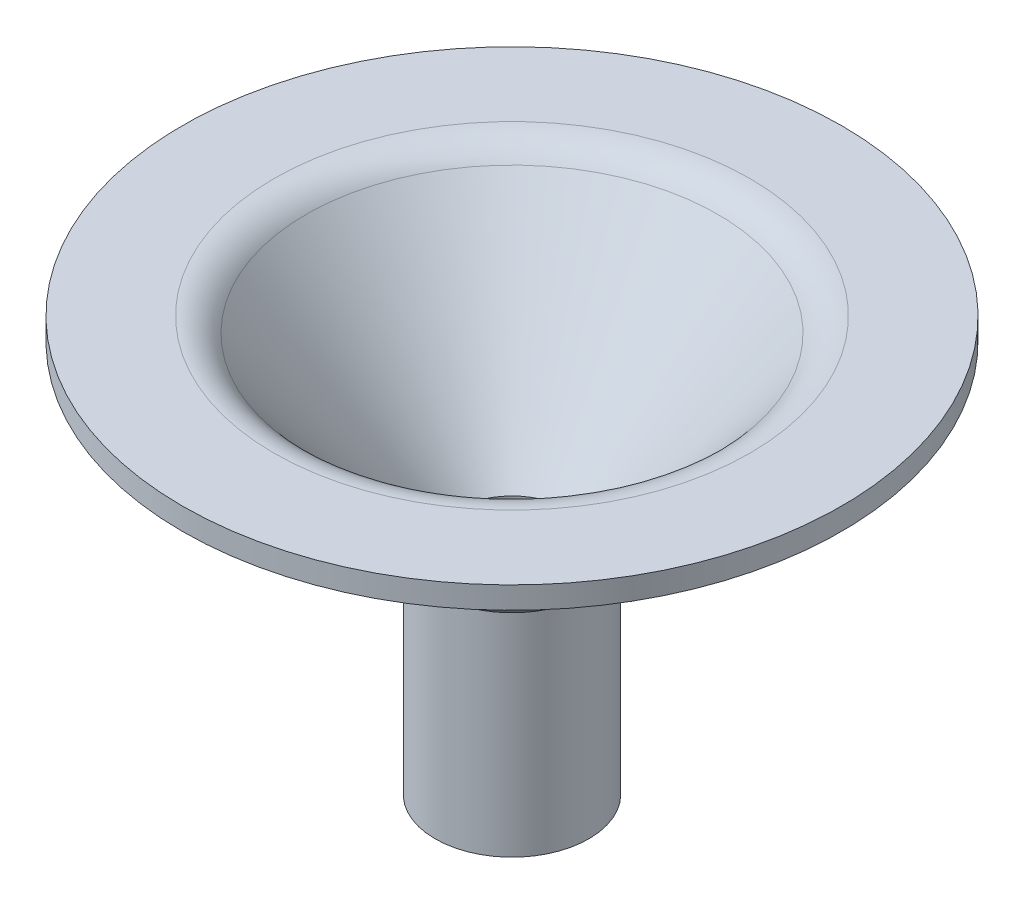
ISO-10303-21;
HEADER;
FILE_DESCRIPTION(('STEP AP214'),'2;1');
FILE_NAME('part.step','',(''),(''),'','','');
FILE_SCHEMA(('AUTOMOTIVE_DESIGN { 1 0 10303 214 1 1 1 1 }'));
ENDSEC;
DATA;
#1=APPLICATION_CONTEXT('core data for automotive mechanical design processes');
#2=APPLICATION_PROTOCOL_DEFINITION('international standard','automotive_design',2000,#1);
#3=PRODUCT_CONTEXT('',#1,'mechanical');
#4=PRODUCT('Part','Part','',(#3));
#5=PRODUCT_RELATED_PRODUCT_CATEGORY('part','',(#4));
#6=PRODUCT_DEFINITION_FORMATION('','',#4);
#7=PRODUCT_DEFINITION_CONTEXT('part definition',#1,'design');
#8=PRODUCT_DEFINITION('design','',#6,#7);
#9=PRODUCT_DEFINITION_SHAPE('','',#8);
#10=(LENGTH_UNIT() NAMED_UNIT(*) SI_UNIT(.MILLI.,.METRE.));
#11=(NAMED_UNIT(*) PLANE_ANGLE_UNIT() SI_UNIT($,.RADIAN.));
#12=(NAMED_UNIT(*) SI_UNIT($,.STERADIAN.) SOLID_ANGLE_UNIT());
#13=UNCERTAINTY_MEASURE_WITH_UNIT(LENGTH_MEASURE(1.E-05),#10,'distance_accuracy_value','');
#14=(GEOMETRIC_REPRESENTATION_CONTEXT(3) GLOBAL_UNCERTAINTY_ASSIGNED_CONTEXT((#13)) GLOBAL_UNIT_ASSIGNED_CONTEXT((#10,
#11,#12)) REPRESENTATION_CONTEXT('',''));
#15=CARTESIAN_POINT('',(0.,0.,0.));
#16=DIRECTION('',(0.,0.,1.));
#17=DIRECTION('',(1.,0.,0.));
#18=AXIS2_PLACEMENT_3D('',#15,#16,#17);
#19=CARTESIAN_POINT('',(0.,3.37655174054899,15.));
#20=DIRECTION('',(0.,1.,0.));
#21=DIRECTION('',(0.,0.,1.));
#22=AXIS2_PLACEMENT_3D('',#19,#20,#21);
#23=PLANE('',#22);
#24=CARTESIAN_POINT('',(0.,3.37655174054898,0.));
#25=DIRECTION('',(0.,1.,0.));
#26=DIRECTION('',(0.,0.,1.));
#27=AXIS2_PLACEMENT_3D('',#24,#25,#26);
#28=CIRCLE('',#27,15.);
#29=CARTESIAN_POINT('',(0.,3.37655174054898,15.));
#30=VERTEX_POINT('',#29);
#31=EDGE_CURVE('E65',#30,#30,#28,.T.);
#32=ORIENTED_EDGE('',*,*,#31,.T.);
#33=EDGE_LOOP('',(#32));
#34=FACE_BOUND('',#33,.T.);
#35=CARTESIAN_POINT('',(0.,3.37655174054901,0.));
#36=DIRECTION('',(0.,1.,0.));
#37=DIRECTION('',(0.,0.,1.));
#38=AXIS2_PLACEMENT_3D('',#35,#36,#37);
#39=CIRCLE('',#38,10.8294505966195);
#40=CARTESIAN_POINT('',(0.,3.37655174054901,10.8294505966195));
#41=VERTEX_POINT('',#40);
#42=EDGE_CURVE('E10',#41,#41,#39,.T.);
#43=ORIENTED_EDGE('',*,*,#42,.F.);
#44=EDGE_LOOP('',(#43));
#45=FACE_BOUND('',#44,.T.);
#46=ADVANCED_FACE('F31',(#34,#45),#23,.T.);
#47=CARTESIAN_POINT('',(0.,1.46823217846935,0.));
#48=DIRECTION('',(0.,1.,0.));
#49=DIRECTION('',(0.,0.,1.));
#50=AXIS2_PLACEMENT_3D('',#47,#48,#49);
#51=TOROIDAL_SURFACE('',#50,10.8294505966195,1.90831956207966);
#52=ORIENTED_EDGE('',*,*,#42,.T.);
#53=EDGE_LOOP('',(#52));
#54=FACE_BOUND('',#53,.T.);
#55=CARTESIAN_POINT('',(0.,2.69487634829658,0.));
#56=DIRECTION('',(0.,1.,0.));
#57=DIRECTION('',(0.,0.,1.));
#58=AXIS2_PLACEMENT_3D('',#55,#56,#57);
#59=CIRCLE('',#58,9.36759300039304);
#60=CARTESIAN_POINT('',(0.,2.69487634829658,9.36759300039304));
#61=VERTEX_POINT('',#60);
#62=EDGE_CURVE('E37',#61,#61,#59,.T.);
#63=ORIENTED_EDGE('',*,*,#62,.F.);
#64=EDGE_LOOP('',(#63));
#65=FACE_BOUND('',#64,.T.);
#66=ADVANCED_FACE('F83',(#54,#65),#51,.T.);
#67=CARTESIAN_POINT('',(0.,-5.48960228239688,0.));
#68=DIRECTION('',(0.,1.,0.));
#69=DIRECTION('',(0.,0.,1.));
#70=AXIS2_PLACEMENT_3D('',#67,#68,#69);
#71=CONICAL_SURFACE('',#70,2.5,0.698131700797719);
#72=CARTESIAN_POINT('',(0.,-5.48960228239688,0.));
#73=DIRECTION('',(0.,1.,0.));
#74=DIRECTION('',(0.,0.,1.));
#75=AXIS2_PLACEMENT_3D('',#72,#73,#74);
#76=CIRCLE('',#75,2.5);
#77=CARTESIAN_POINT('',(0.,-5.48960228239688,2.5));
#78=VERTEX_POINT('',#77);
#79=EDGE_CURVE('E41',#78,#78,#76,.T.);
#80=CARTESIAN_POINT('',(0.,2.69487634829658,9.36759300039304));
#81=CARTESIAN_POINT('',(0.,2.60962136256019,9.29605557330561));
#82=CARTESIAN_POINT('',(0.,2.5243663768238,9.22451814621819));
#83=CARTESIAN_POINT('',(0.,2.35385640535102,9.08144329204333));
#84=CARTESIAN_POINT('',(0.,2.26860141961463,9.0099058649559));
#85=CARTESIAN_POINT('',(0.,2.09809144814185,8.86683101078105));
#86=CARTESIAN_POINT('',(0.,2.01283646240546,8.79529358369362));
#87=CARTESIAN_POINT('',(0.,1.84232649093268,8.65221872951877));
#88=CARTESIAN_POINT('',(0.,1.75707150519629,8.58068130243134));
#89=CARTESIAN_POINT('',(0.,1.58656153372351,8.43760644825648));
#90=CARTESIAN_POINT('',(0.,1.50130654798712,8.36606902116906));
#91=CARTESIAN_POINT('',(0.,1.33079657651434,8.2229941669942));
#92=CARTESIAN_POINT('',(0.,1.24554159077795,8.15145673990677));
#93=CARTESIAN_POINT('',(0.,1.07503161930517,8.00838188573192));
#94=CARTESIAN_POINT('',(0.,0.989776633568776,7.93684445864449));
#95=CARTESIAN_POINT('',(0.,0.819266662095995,7.79376960446963));
#96=CARTESIAN_POINT('',(0.,0.734011676359605,7.72223217738221));
#97=CARTESIAN_POINT('',(0.,0.563501704886824,7.57915732320735));
#98=CARTESIAN_POINT('',(0.,0.478246719150434,7.50761989611993));
#99=CARTESIAN_POINT('',(0.,0.307736747677653,7.36454504194507));
#100=CARTESIAN_POINT('',(0.,0.222481761941263,7.29300761485764));
#101=CARTESIAN_POINT('',(0.,0.0519717904684826,7.14993276068279));
#102=CARTESIAN_POINT('',(0.,-0.0332831952679078,7.07839533359536));
#103=CARTESIAN_POINT('',(0.,-0.203793166740688,6.93532047942051));
#104=CARTESIAN_POINT('',(0.,-0.289048152477078,6.86378305233308));
#105=CARTESIAN_POINT('',(0.,-0.459558123949859,6.72070819815822));
#106=CARTESIAN_POINT('',(0.,-0.544813109686249,6.6491707710708));
#107=CARTESIAN_POINT('',(0.,-0.71532308115903,6.50609591689594));
#108=CARTESIAN_POINT('',(0.,-0.80057806689542,6.43455848980851));
#109=CARTESIAN_POINT('',(0.,-0.971088038368201,6.29148363563366));
#110=CARTESIAN_POINT('',(0.,-1.05634302410459,6.21994620854623));
#111=CARTESIAN_POINT('',(0.,-1.22685299557737,6.07687135437138));
#112=CARTESIAN_POINT('',(0.,-1.31210798131376,6.00533392728395));
#113=CARTESIAN_POINT('',(0.,-1.48261795278654,5.86225907310909));
#114=CARTESIAN_POINT('',(0.,-1.56787293852293,5.79072164602167));
#115=CARTESIAN_POINT('',(0.,-1.73838290999571,5.64764679184681));
#116=CARTESIAN_POINT('',(0.,-1.8236378957321,5.57610936475939));
#117=CARTESIAN_POINT('',(0.,-1.99414786720488,5.43303451058453));
#118=CARTESIAN_POINT('',(0.,-2.07940285294127,5.3614970834971));
#119=CARTESIAN_POINT('',(0.,-2.24991282441405,5.21842222932225));
#120=CARTESIAN_POINT('',(0.,-2.33516781015044,5.14688480223482));
#121=CARTESIAN_POINT('',(0.,-2.50567778162323,5.00380994805996));
#122=CARTESIAN_POINT('',(0.,-2.59093276735962,4.93227252097254));
#123=CARTESIAN_POINT('',(0.,-2.7614427388324,4.78919766679768));
#124=CARTESIAN_POINT('',(0.,-2.84669772456879,4.71766023971025));
#125=CARTESIAN_POINT('',(0.,-3.01720769604157,4.5745853855354));
#126=CARTESIAN_POINT('',(0.,-3.10246268177796,4.50304795844797));
#127=CARTESIAN_POINT('',(0.,-3.27297265325074,4.35997310427312));
#128=CARTESIAN_POINT('',(0.,-3.35822763898713,4.28843567718569));
#129=CARTESIAN_POINT('',(0.,-3.52873761045991,4.14536082301083));
#130=CARTESIAN_POINT('',(0.,-3.6139925961963,4.07382339592341));
#131=CARTESIAN_POINT('',(0.,-3.78450256766908,3.93074854174855));
#132=CARTESIAN_POINT('',(0.,-3.86975755340547,3.85921111466112));
#133=CARTESIAN_POINT('',(0.,-4.04026752487825,3.71613626048627));
#134=CARTESIAN_POINT('',(0.,-4.12552251061464,3.64459883339884));
#135=CARTESIAN_POINT('',(0.,-4.29603248208742,3.50152397922399));
#136=CARTESIAN_POINT('',(0.,-4.38128746782381,3.42998655213656));
#137=CARTESIAN_POINT('',(0.,-4.55179743929659,3.2869116979617));
#138=CARTESIAN_POINT('',(0.,-4.63705242503298,3.21537427087428));
#139=CARTESIAN_POINT('',(0.,-4.80756239650576,3.07229941669942));
#140=CARTESIAN_POINT('',(0.,-4.89281738224215,3.00076198961199));
#141=CARTESIAN_POINT('',(0.,-5.06332735371493,2.85768713543714));
#142=CARTESIAN_POINT('',(0.,-5.14858233945132,2.78614970834971));
#143=CARTESIAN_POINT('',(0.,-5.3190923109241,2.64307485417486));
#144=CARTESIAN_POINT('',(0.,-5.40434729666049,2.57153742708743));
#145=CARTESIAN_POINT('',(0.,-5.48960228239688,2.5));
#146=B_SPLINE_CURVE_WITH_KNOTS('',3,(#80,#81,#82,#83,#84,#85,#86,#87,#88,#89,#90,#91,#92,#93,
#94,#95,#96,#97,#98,#99,#100,#101,#102,#103,#104,#105,#106,#107,#108,#109,#110,#111,#112,#113,
#114,#115,#116,#117,#118,#119,#120,#121,#122,#123,#124,#125,#126,#127,#128,#129,#130,#131,#132,
#133,#134,#135,#136,#137,#138,#139,#140,#141,#142,#143,#144,#145),.UNSPECIFIED.,.F.,.F.,(4,2,2,
2,2,2,2,2,2,2,2,2,2,2,2,2,2,2,2,2,2,2,2,2,2,2,2,2,2,2,2,2,4),(0.,0.333877439496607,
0.667754878993213,1.00163231848982,1.33550975798643,1.66938719748303,2.00326463697964,
2.33714207647624,2.67101951597285,3.00489695546946,3.33877439496606,3.67265183446267,
4.00652927395927,4.34040671345588,4.67428415295249,5.00816159244909,5.3420390319457,
5.6759164714423,6.00979391093891,6.34367135043552,6.67754878993212,7.01142622942873,
7.34530366892534,7.67918110842194,8.01305854791855,8.34693598741516,8.68081342691176,
9.01469086640837,9.34856830590497,9.68244574540158,10.0163231848982,10.3502006243948,
10.6840780638914),.UNSPECIFIED.);
#147=EDGE_CURVE('BSEAM87',#61,#78,#146,.T.);
#148=ORIENTED_EDGE('',*,*,#62,.T.);
#149=ORIENTED_EDGE('',*,*,#79,.F.);
#150=ORIENTED_EDGE('',*,*,#147,.T.);
#151=ORIENTED_EDGE('',*,*,#147,.F.);
#152=EDGE_LOOP('',(#148,#150,#149,#151));
#153=FACE_BOUND('',#152,.T.);
#154=ADVANCED_FACE('F87',(#153),#71,.F.);
#155=CARTESIAN_POINT('',(0.,16.0219681440738,0.));
#156=DIRECTION('',(0.,1.,0.));
#157=DIRECTION('',(0.,0.,1.));
#158=AXIS2_PLACEMENT_3D('',#155,#156,#157);
#159=CYLINDRICAL_SURFACE('',#158,2.5);
#160=ORIENTED_EDGE('',*,*,#79,.T.);
#161=EDGE_LOOP('',(#160));
#162=FACE_BOUND('',#161,.T.);
#163=CARTESIAN_POINT('',(0.,-15.4896022823969,0.));
#164=DIRECTION('',(0.,1.,0.));
#165=DIRECTION('',(0.,0.,1.));
#166=AXIS2_PLACEMENT_3D('',#163,#164,#165);
#167=CIRCLE('',#166,2.5);
#168=CARTESIAN_POINT('',(0.,-15.4896022823969,2.5));
#169=VERTEX_POINT('',#168);
#170=EDGE_CURVE('E45',#169,#169,#167,.T.);
#171=ORIENTED_EDGE('',*,*,#170,.F.);
#172=EDGE_LOOP('',(#171));
#173=FACE_BOUND('',#172,.T.);
#174=ADVANCED_FACE('F91',(#162,#173),#159,.F.);
#175=CARTESIAN_POINT('',(0.,-15.4896022823969,2.5));
#176=DIRECTION('',(0.,-1.,0.));
#177=DIRECTION('',(0.,0.,-1.));
#178=AXIS2_PLACEMENT_3D('',#175,#176,#177);
#179=PLANE('',#178);
#180=ORIENTED_EDGE('',*,*,#170,.T.);
#181=EDGE_LOOP('',(#180));
#182=FACE_BOUND('',#181,.T.);
#183=CARTESIAN_POINT('',(0.,-15.4896022823969,0.));
#184=DIRECTION('',(0.,1.,0.));
#185=DIRECTION('',(0.,0.,1.));
#186=AXIS2_PLACEMENT_3D('',#183,#184,#185);
#187=CIRCLE('',#186,3.50000000000001);
#188=CARTESIAN_POINT('',(0.,-15.4896022823969,3.5));
#189=VERTEX_POINT('',#188);
#190=EDGE_CURVE('E50',#189,#189,#187,.T.);
#191=ORIENTED_EDGE('',*,*,#190,.F.);
#192=EDGE_LOOP('',(#191));
#193=FACE_BOUND('',#192,.T.);
#194=ADVANCED_FACE('F97',(#182,#193),#179,.T.);
#195=CARTESIAN_POINT('',(0.,16.0219681440738,0.));
#196=DIRECTION('',(0.,1.,0.));
#197=DIRECTION('',(0.,0.,1.));
#198=AXIS2_PLACEMENT_3D('',#195,#196,#197);
#199=CYLINDRICAL_SURFACE('',#198,3.50000000000001);
#200=ORIENTED_EDGE('',*,*,#190,.T.);
#201=EDGE_LOOP('',(#200));
#202=FACE_BOUND('',#201,.T.);
#203=CARTESIAN_POINT('',(0.,-5.85357251666309,0.));
#204=DIRECTION('',(0.,1.,0.));
#205=DIRECTION('',(0.,0.,1.));
#206=AXIS2_PLACEMENT_3D('',#203,#204,#205);
#207=CIRCLE('',#206,3.5);
#208=CARTESIAN_POINT('',(0.,-5.85357251666309,3.5));
#209=VERTEX_POINT('',#208);
#210=EDGE_CURVE('E53',#209,#209,#207,.T.);
#211=ORIENTED_EDGE('',*,*,#210,.F.);
#212=EDGE_LOOP('',(#211));
#213=FACE_BOUND('',#212,.T.);
#214=ADVANCED_FACE('F101',(#202,#213),#199,.T.);
#215=CARTESIAN_POINT('',(0.,2.05208873861003,0.));
#216=DIRECTION('',(0.,1.,0.));
#217=DIRECTION('',(0.,0.,1.));
#218=AXIS2_PLACEMENT_3D('',#215,#216,#217);
#219=CONICAL_SURFACE('',#218,10.1336374435121,0.698131700797722);
#220=ORIENTED_EDGE('',*,*,#210,.T.);
#221=EDGE_LOOP('',(#220));
#222=FACE_BOUND('',#221,.T.);
#223=CARTESIAN_POINT('',(0.,2.05208873861003,0.));
#224=DIRECTION('',(0.,1.,0.));
#225=DIRECTION('',(0.,0.,1.));
#226=AXIS2_PLACEMENT_3D('',#223,#224,#225);
#227=CIRCLE('',#226,10.1336374435121);
#228=CARTESIAN_POINT('',(0.,2.05208873861003,10.1336374435121));
#229=VERTEX_POINT('',#228);
#230=EDGE_CURVE('E56',#229,#229,#227,.T.);
#231=ORIENTED_EDGE('',*,*,#230,.F.);
#232=EDGE_LOOP('',(#231));
#233=FACE_BOUND('',#232,.T.);
#234=ADVANCED_FACE('F105',(#222,#233),#219,.T.);
#235=CARTESIAN_POINT('',(0.,1.46823217846935,0.));
#236=DIRECTION('',(0.,1.,0.));
#237=DIRECTION('',(0.,0.,1.));
#238=AXIS2_PLACEMENT_3D('',#235,#236,#237);
#239=TOROIDAL_SURFACE('',#238,10.8294505966195,0.908319562079658);
#240=ORIENTED_EDGE('',*,*,#230,.T.);
#241=EDGE_LOOP('',(#240));
#242=FACE_BOUND('',#241,.T.);
#243=CARTESIAN_POINT('',(0.,2.37655174054898,0.));
#244=DIRECTION('',(0.,1.,0.));
#245=DIRECTION('',(0.,0.,1.));
#246=AXIS2_PLACEMENT_3D('',#243,#244,#245);
#247=CIRCLE('',#246,10.8294505966195);
#248=CARTESIAN_POINT('',(0.,2.37655174054898,10.8294505966195));
#249=VERTEX_POINT('',#248);
#250=EDGE_CURVE('E59',#249,#249,#247,.T.);
#251=ORIENTED_EDGE('',*,*,#250,.F.);
#252=EDGE_LOOP('',(#251));
#253=FACE_BOUND('',#252,.T.);
#254=ADVANCED_FACE('F79',(#242,#253),#239,.F.);
#255=CARTESIAN_POINT('',(0.,2.37655174054898,15.));
#256=DIRECTION('',(0.,-1.,0.));
#257=DIRECTION('',(0.,0.,-1.));
#258=AXIS2_PLACEMENT_3D('',#255,#256,#257);
#259=PLANE('',#258);
#260=ORIENTED_EDGE('',*,*,#250,.T.);
#261=EDGE_LOOP('',(#260));
#262=FACE_BOUND('',#261,.T.);
#263=CARTESIAN_POINT('',(0.,2.37655174054898,0.));
#264=DIRECTION('',(0.,1.,0.));
#265=DIRECTION('',(0.,0.,1.));
#266=AXIS2_PLACEMENT_3D('',#263,#264,#265);
#267=CIRCLE('',#266,15.);
#268=CARTESIAN_POINT('',(0.,2.37655174054898,15.));
#269=VERTEX_POINT('',#268);
#270=EDGE_CURVE('E62',#269,#269,#267,.T.);
#271=ORIENTED_EDGE('',*,*,#270,.F.);
#272=EDGE_LOOP('',(#271));
#273=FACE_BOUND('',#272,.T.);
#274=ADVANCED_FACE('F73',(#262,#273),#259,.T.);
#275=CARTESIAN_POINT('',(0.,16.0219681440738,0.));
#276=DIRECTION('',(0.,1.,0.));
#277=DIRECTION('',(0.,0.,1.));
#278=AXIS2_PLACEMENT_3D('',#275,#276,#277);
#279=CYLINDRICAL_SURFACE('',#278,15.);
#280=ORIENTED_EDGE('',*,*,#270,.T.);
#281=EDGE_LOOP('',(#280));
#282=FACE_BOUND('',#281,.T.);
#283=ORIENTED_EDGE('',*,*,#31,.F.);
#284=EDGE_LOOP('',(#283));
#285=FACE_BOUND('',#284,.T.);
#286=ADVANCED_FACE('F71',(#282,#285),#279,.T.);
#287=CLOSED_SHELL('',(#46,#66,#154,#174,#194,#214,#234,#254,#274,#286));
#288=MANIFOLD_SOLID_BREP('B2',#287);
#289=ADVANCED_BREP_SHAPE_REPRESENTATION('',(#18,#288),#14);
#290=SHAPE_DEFINITION_REPRESENTATION(#9,#289);
ENDSEC;
END-ISO-10303-21;
